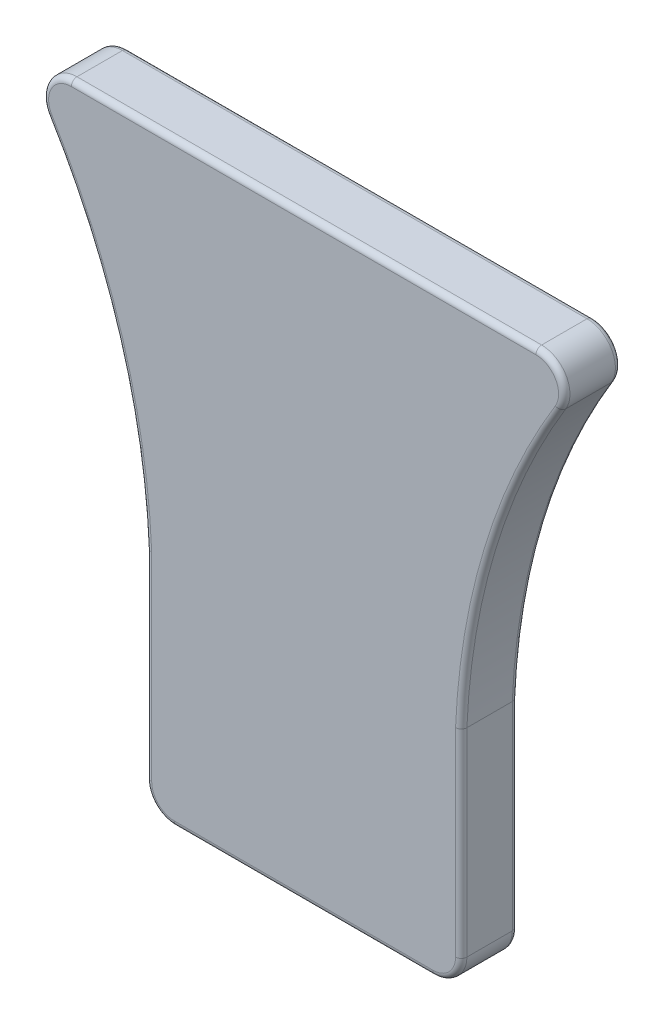
ISO-10303-21;
HEADER;
FILE_DESCRIPTION(('STEP AP214'),'2;1');
FILE_NAME('part.step','',(''),(''),'','','');
FILE_SCHEMA(('AUTOMOTIVE_DESIGN { 1 0 10303 214 1 1 1 1 }'));
ENDSEC;
DATA;
#1=APPLICATION_CONTEXT('core data for automotive mechanical design processes');
#2=APPLICATION_PROTOCOL_DEFINITION('international standard','automotive_design',2000,#1);
#3=PRODUCT_CONTEXT('',#1,'mechanical');
#4=PRODUCT('Part','Part','',(#3));
#5=PRODUCT_RELATED_PRODUCT_CATEGORY('part','',(#4));
#6=PRODUCT_DEFINITION_FORMATION('','',#4);
#7=PRODUCT_DEFINITION_CONTEXT('part definition',#1,'design');
#8=PRODUCT_DEFINITION('design','',#6,#7);
#9=PRODUCT_DEFINITION_SHAPE('','',#8);
#10=(LENGTH_UNIT() NAMED_UNIT(*) SI_UNIT(.MILLI.,.METRE.));
#11=(NAMED_UNIT(*) PLANE_ANGLE_UNIT() SI_UNIT($,.RADIAN.));
#12=(NAMED_UNIT(*) SI_UNIT($,.STERADIAN.) SOLID_ANGLE_UNIT());
#13=UNCERTAINTY_MEASURE_WITH_UNIT(LENGTH_MEASURE(1.E-05),#10,'distance_accuracy_value','');
#14=(GEOMETRIC_REPRESENTATION_CONTEXT(3) GLOBAL_UNCERTAINTY_ASSIGNED_CONTEXT((#13)) GLOBAL_UNIT_ASSIGNED_CONTEXT((#10,
#11,#12)) REPRESENTATION_CONTEXT('',''));
#15=CARTESIAN_POINT('',(0.,0.,0.));
#16=DIRECTION('',(0.,0.,1.));
#17=DIRECTION('',(1.,0.,0.));
#18=AXIS2_PLACEMENT_3D('',#15,#16,#17);
#19=CARTESIAN_POINT('',(-22.7713174122212,5.,10.));
#20=DIRECTION('',(0.,0.,-1.));
#21=DIRECTION('',(-1.,0.,0.));
#22=AXIS2_PLACEMENT_3D('',#19,#20,#21);
#23=CYLINDRICAL_SURFACE('',#22,5.);
#24=DIRECTION('',(0.,0.,-1.));
#25=VECTOR('',#24,1.);
#26=CARTESIAN_POINT('',(-27.7713174122212,5.00000000000004,10.));
#27=LINE('',#26,#25);
#28=CARTESIAN_POINT('',(-27.7713174122212,5.00000000000004,9.));
#29=VERTEX_POINT('',#28);
#30=CARTESIAN_POINT('',(-27.7713174122212,5.00000000000004,0.999999999999999));
#31=VERTEX_POINT('',#30);
#32=EDGE_CURVE('E391',#29,#31,#27,.T.);
#33=ORIENTED_EDGE('',*,*,#32,.T.);
#34=CARTESIAN_POINT('',(-22.7713174122212,5.,0.999999999999999));
#35=DIRECTION('',(0.,0.,1.));
#36=DIRECTION('',(1.,0.,0.));
#37=AXIS2_PLACEMENT_3D('',#34,#35,#36);
#38=CIRCLE('',#37,5.);
#39=CARTESIAN_POINT('',(-22.7713174122212,0.,0.999999999999999));
#40=VERTEX_POINT('',#39);
#41=EDGE_CURVE('E248',#31,#40,#38,.T.);
#42=ORIENTED_EDGE('',*,*,#41,.T.);
#43=DIRECTION('',(0.,0.,-1.));
#44=VECTOR('',#43,1.);
#45=CARTESIAN_POINT('',(-22.7713174122212,0.,10.));
#46=LINE('',#45,#44);
#47=CARTESIAN_POINT('',(-22.7713174122212,0.,9.));
#48=VERTEX_POINT('',#47);
#49=EDGE_CURVE('E206',#48,#40,#46,.T.);
#50=ORIENTED_EDGE('',*,*,#49,.F.);
#51=CARTESIAN_POINT('',(-22.7713174122212,5.,9.));
#52=DIRECTION('',(0.,0.,1.));
#53=DIRECTION('',(1.,0.,0.));
#54=AXIS2_PLACEMENT_3D('',#51,#52,#53);
#55=CIRCLE('',#54,5.);
#56=EDGE_CURVE('E246',#48,#29,#55,.F.);
#57=ORIENTED_EDGE('',*,*,#56,.T.);
#58=EDGE_LOOP('',(#33,#42,#50,#57));
#59=FACE_BOUND('',#58,.T.);
#60=ADVANCED_FACE('F33',(#59),#23,.T.);
#61=CARTESIAN_POINT('',(-22.7713174122212,0.,10.));
#62=DIRECTION('',(0.,1.,0.));
#63=DIRECTION('',(0.,0.,1.));
#64=AXIS2_PLACEMENT_3D('',#61,#62,#63);
#65=PLANE('',#64);
#66=ORIENTED_EDGE('',*,*,#49,.T.);
#67=DIRECTION('',(1.,0.,0.));
#68=VECTOR('',#67,1.);
#69=CARTESIAN_POINT('',(-22.7713174122212,0.,0.999999999999999));
#70=LINE('',#69,#68);
#71=CARTESIAN_POINT('',(22.7713174122212,0.,0.999999999999999));
#72=VERTEX_POINT('',#71);
#73=EDGE_CURVE('E271',#40,#72,#70,.T.);
#74=ORIENTED_EDGE('',*,*,#73,.T.);
#75=DIRECTION('',(0.,0.,-1.));
#76=VECTOR('',#75,1.);
#77=CARTESIAN_POINT('',(22.7713174122212,0.,10.));
#78=LINE('',#77,#76);
#79=CARTESIAN_POINT('',(22.7713174122212,0.,9.));
#80=VERTEX_POINT('',#79);
#81=EDGE_CURVE('E433',#80,#72,#78,.T.);
#82=ORIENTED_EDGE('',*,*,#81,.F.);
#83=DIRECTION('',(1.,0.,0.));
#84=VECTOR('',#83,1.);
#85=CARTESIAN_POINT('',(-22.7713174122212,0.,9.));
#86=LINE('',#85,#84);
#87=EDGE_CURVE('E269',#80,#48,#86,.F.);
#88=ORIENTED_EDGE('',*,*,#87,.T.);
#89=EDGE_LOOP('',(#66,#74,#82,#88));
#90=FACE_BOUND('',#89,.T.);
#91=ADVANCED_FACE('F352',(#90),#65,.F.);
#92=CARTESIAN_POINT('',(22.7713174122212,5.,10.));
#93=DIRECTION('',(0.,0.,-1.));
#94=DIRECTION('',(-1.,0.,0.));
#95=AXIS2_PLACEMENT_3D('',#92,#93,#94);
#96=CYLINDRICAL_SURFACE('',#95,5.00000000000001);
#97=ORIENTED_EDGE('',*,*,#81,.T.);
#98=CARTESIAN_POINT('',(22.7713174122212,5.,0.999999999999999));
#99=DIRECTION('',(0.,0.,1.));
#100=DIRECTION('',(1.,0.,0.));
#101=AXIS2_PLACEMENT_3D('',#98,#99,#100);
#102=CIRCLE('',#101,5.00000000000001);
#103=CARTESIAN_POINT('',(27.7713174122212,5.00000000000004,0.999999999999999));
#104=VERTEX_POINT('',#103);
#105=EDGE_CURVE('E256',#72,#104,#102,.T.);
#106=ORIENTED_EDGE('',*,*,#105,.T.);
#107=DIRECTION('',(0.,0.,-1.));
#108=VECTOR('',#107,1.);
#109=CARTESIAN_POINT('',(27.7713174122212,5.00000000000004,10.));
#110=LINE('',#109,#108);
#111=CARTESIAN_POINT('',(27.7713174122212,5.00000000000004,9.));
#112=VERTEX_POINT('',#111);
#113=EDGE_CURVE('E436',#112,#104,#110,.T.);
#114=ORIENTED_EDGE('',*,*,#113,.F.);
#115=CARTESIAN_POINT('',(22.7713174122212,5.,9.));
#116=DIRECTION('',(0.,0.,1.));
#117=DIRECTION('',(1.,0.,0.));
#118=AXIS2_PLACEMENT_3D('',#115,#116,#117);
#119=CIRCLE('',#118,5.00000000000001);
#120=EDGE_CURVE('E254',#112,#80,#119,.F.);
#121=ORIENTED_EDGE('',*,*,#120,.T.);
#122=EDGE_LOOP('',(#97,#106,#114,#121));
#123=FACE_BOUND('',#122,.T.);
#124=ADVANCED_FACE('F358',(#123),#96,.T.);
#125=CARTESIAN_POINT('',(27.7713174122212,5.00000000000004,10.));
#126=DIRECTION('',(-1.,0.,0.));
#127=DIRECTION('',(0.,-1.,0.));
#128=AXIS2_PLACEMENT_3D('',#125,#126,#127);
#129=PLANE('',#128);
#130=ORIENTED_EDGE('',*,*,#113,.T.);
#131=DIRECTION('',(0.,1.,0.));
#132=VECTOR('',#131,1.);
#133=CARTESIAN_POINT('',(27.7713174122212,5.00000000000004,0.999999999999999));
#134=LINE('',#133,#132);
#135=CARTESIAN_POINT('',(27.7713174122212,40.,0.999999999999999));
#136=VERTEX_POINT('',#135);
#137=EDGE_CURVE('E252',#104,#136,#134,.T.);
#138=ORIENTED_EDGE('',*,*,#137,.T.);
#139=DIRECTION('',(0.,0.,-1.));
#140=VECTOR('',#139,1.);
#141=CARTESIAN_POINT('',(27.7713174122212,40.,10.));
#142=LINE('',#141,#140);
#143=CARTESIAN_POINT('',(27.7713174122212,40.,9.));
#144=VERTEX_POINT('',#143);
#145=EDGE_CURVE('E199',#144,#136,#142,.T.);
#146=ORIENTED_EDGE('',*,*,#145,.F.);
#147=DIRECTION('',(0.,1.,0.));
#148=VECTOR('',#147,1.);
#149=CARTESIAN_POINT('',(27.7713174122212,5.00000000000004,9.));
#150=LINE('',#149,#148);
#151=EDGE_CURVE('E250',#144,#112,#150,.F.);
#152=ORIENTED_EDGE('',*,*,#151,.T.);
#153=EDGE_LOOP('',(#130,#138,#146,#152));
#154=FACE_BOUND('',#153,.T.);
#155=ADVANCED_FACE('F524',(#154),#129,.F.);
#156=CARTESIAN_POINT('',(147.663922100317,34.9242398496352,10.));
#157=DIRECTION('',(0.,0.,-1.));
#158=DIRECTION('',(-1.,0.,0.));
#159=AXIS2_PLACEMENT_3D('',#156,#157,#158);
#160=CYLINDRICAL_SURFACE('',#159,120.);
#161=ORIENTED_EDGE('',*,*,#145,.T.);
#162=CARTESIAN_POINT('',(147.663922100317,34.9242398496352,0.999999999999999));
#163=DIRECTION('',(0.,0.,1.));
#164=DIRECTION('',(1.,0.,0.));
#165=AXIS2_PLACEMENT_3D('',#162,#163,#164);
#166=CIRCLE('',#165,120.);
#167=CARTESIAN_POINT('',(45.2082827323963,97.3969695939854,0.999999999999999));
#168=VERTEX_POINT('',#167);
#169=EDGE_CURVE('E198',#136,#168,#166,.F.);
#170=ORIENTED_EDGE('',*,*,#169,.T.);
#171=DIRECTION('',(0.,0.,-1.));
#172=VECTOR('',#171,1.);
#173=CARTESIAN_POINT('',(45.2082827323963,97.3969695939854,10.));
#174=LINE('',#173,#172);
#175=CARTESIAN_POINT('',(45.2082827323963,97.3969695939854,9.));
#176=VERTEX_POINT('',#175);
#177=EDGE_CURVE('E179',#176,#168,#174,.T.);
#178=ORIENTED_EDGE('',*,*,#177,.F.);
#179=CARTESIAN_POINT('',(147.663922100317,34.9242398496352,9.));
#180=DIRECTION('',(0.,0.,1.));
#181=DIRECTION('',(1.,0.,0.));
#182=AXIS2_PLACEMENT_3D('',#179,#180,#181);
#183=CIRCLE('',#182,120.);
#184=EDGE_CURVE('E195',#176,#144,#183,.T.);
#185=ORIENTED_EDGE('',*,*,#184,.T.);
#186=EDGE_LOOP('',(#161,#170,#178,#185));
#187=FACE_BOUND('',#186,.T.);
#188=ADVANCED_FACE('F194',(#187),#160,.F.);
#189=CARTESIAN_POINT('',(40.9392977587329,100.,10.));
#190=DIRECTION('',(0.,0.,-1.));
#191=DIRECTION('',(-1.,0.,0.));
#192=AXIS2_PLACEMENT_3D('',#189,#190,#191);
#193=CYLINDRICAL_SURFACE('',#192,5.00000000000002);
#194=ORIENTED_EDGE('',*,*,#177,.T.);
#195=CARTESIAN_POINT('',(40.9392977587329,100.,0.999999999999999));
#196=DIRECTION('',(0.,0.,1.));
#197=DIRECTION('',(1.,0.,0.));
#198=AXIS2_PLACEMENT_3D('',#195,#196,#197);
#199=CIRCLE('',#198,5.00000000000002);
#200=CARTESIAN_POINT('',(40.9392977587329,105.,0.999999999999999));
#201=VERTEX_POINT('',#200);
#202=EDGE_CURVE('E186',#168,#201,#199,.T.);
#203=ORIENTED_EDGE('',*,*,#202,.T.);
#204=DIRECTION('',(0.,0.,-1.));
#205=VECTOR('',#204,1.);
#206=CARTESIAN_POINT('',(40.9392977587329,105.,10.));
#207=LINE('',#206,#205);
#208=CARTESIAN_POINT('',(40.9392977587329,105.,9.));
#209=VERTEX_POINT('',#208);
#210=EDGE_CURVE('E181',#209,#201,#207,.T.);
#211=ORIENTED_EDGE('',*,*,#210,.F.);
#212=CARTESIAN_POINT('',(40.9392977587329,100.,9.));
#213=DIRECTION('',(0.,0.,1.));
#214=DIRECTION('',(1.,0.,0.));
#215=AXIS2_PLACEMENT_3D('',#212,#213,#214);
#216=CIRCLE('',#215,5.00000000000002);
#217=EDGE_CURVE('E176',#209,#176,#216,.F.);
#218=ORIENTED_EDGE('',*,*,#217,.T.);
#219=EDGE_LOOP('',(#194,#203,#211,#218));
#220=FACE_BOUND('',#219,.T.);
#221=ADVANCED_FACE('F178',(#220),#193,.T.);
#222=CARTESIAN_POINT('',(-40.9392977587329,105.,10.));
#223=DIRECTION('',(0.,-1.,0.));
#224=DIRECTION('',(0.,0.,-1.));
#225=AXIS2_PLACEMENT_3D('',#222,#223,#224);
#226=PLANE('',#225);
#227=ORIENTED_EDGE('',*,*,#210,.T.);
#228=DIRECTION('',(-1.,0.,0.));
#229=VECTOR('',#228,1.);
#230=CARTESIAN_POINT('',(-40.9392977587329,105.,0.999999999999999));
#231=LINE('',#230,#229);
#232=CARTESIAN_POINT('',(-40.9392977587329,105.,0.999999999999999));
#233=VERTEX_POINT('',#232);
#234=EDGE_CURVE('E232',#201,#233,#231,.T.);
#235=ORIENTED_EDGE('',*,*,#234,.T.);
#236=DIRECTION('',(0.,0.,-1.));
#237=VECTOR('',#236,1.);
#238=CARTESIAN_POINT('',(-40.9392977587329,105.,10.));
#239=LINE('',#238,#237);
#240=CARTESIAN_POINT('',(-40.9392977587329,105.,9.));
#241=VERTEX_POINT('',#240);
#242=EDGE_CURVE('E441',#241,#233,#239,.T.);
#243=ORIENTED_EDGE('',*,*,#242,.F.);
#244=DIRECTION('',(-1.,0.,0.));
#245=VECTOR('',#244,1.);
#246=CARTESIAN_POINT('',(40.9392977587329,105.,9.));
#247=LINE('',#246,#245);
#248=EDGE_CURVE('E403',#241,#209,#247,.F.);
#249=ORIENTED_EDGE('',*,*,#248,.T.);
#250=EDGE_LOOP('',(#227,#235,#243,#249));
#251=FACE_BOUND('',#250,.T.);
#252=ADVANCED_FACE('F506',(#251),#226,.F.);
#253=CARTESIAN_POINT('',(-40.9392977587329,100.,10.));
#254=DIRECTION('',(0.,0.,-1.));
#255=DIRECTION('',(-1.,0.,0.));
#256=AXIS2_PLACEMENT_3D('',#253,#254,#255);
#257=CYLINDRICAL_SURFACE('',#256,5.00000000000002);
#258=ORIENTED_EDGE('',*,*,#242,.T.);
#259=CARTESIAN_POINT('',(-40.9392977587329,100.,0.999999999999999));
#260=DIRECTION('',(0.,0.,1.));
#261=DIRECTION('',(1.,0.,0.));
#262=AXIS2_PLACEMENT_3D('',#259,#260,#261);
#263=CIRCLE('',#262,5.00000000000002);
#264=CARTESIAN_POINT('',(-45.2082827323963,97.3969695939854,0.999999999999999));
#265=VERTEX_POINT('',#264);
#266=EDGE_CURVE('E387',#233,#265,#263,.T.);
#267=ORIENTED_EDGE('',*,*,#266,.T.);
#268=DIRECTION('',(0.,0.,-1.));
#269=VECTOR('',#268,1.);
#270=CARTESIAN_POINT('',(-45.2082827323963,97.3969695939854,10.));
#271=LINE('',#270,#269);
#272=CARTESIAN_POINT('',(-45.2082827323963,97.3969695939854,9.));
#273=VERTEX_POINT('',#272);
#274=EDGE_CURVE('E444',#273,#265,#271,.T.);
#275=ORIENTED_EDGE('',*,*,#274,.F.);
#276=CARTESIAN_POINT('',(-40.9392977587329,100.,9.));
#277=DIRECTION('',(0.,0.,1.));
#278=DIRECTION('',(1.,0.,0.));
#279=AXIS2_PLACEMENT_3D('',#276,#277,#278);
#280=CIRCLE('',#279,5.00000000000002);
#281=EDGE_CURVE('E414',#273,#241,#280,.F.);
#282=ORIENTED_EDGE('',*,*,#281,.T.);
#283=EDGE_LOOP('',(#258,#267,#275,#282));
#284=FACE_BOUND('',#283,.T.);
#285=ADVANCED_FACE('F502',(#284),#257,.T.);
#286=CARTESIAN_POINT('',(-147.663922100317,34.9242398496352,10.));
#287=DIRECTION('',(0.,0.,-1.));
#288=DIRECTION('',(-1.,0.,0.));
#289=AXIS2_PLACEMENT_3D('',#286,#287,#288);
#290=CYLINDRICAL_SURFACE('',#289,120.);
#291=ORIENTED_EDGE('',*,*,#274,.T.);
#292=CARTESIAN_POINT('',(-147.663922100317,34.9242398496352,0.999999999999999));
#293=DIRECTION('',(0.,0.,1.));
#294=DIRECTION('',(1.,0.,0.));
#295=AXIS2_PLACEMENT_3D('',#292,#293,#294);
#296=CIRCLE('',#295,120.);
#297=CARTESIAN_POINT('',(-27.7713174122212,40.,0.999999999999999));
#298=VERTEX_POINT('',#297);
#299=EDGE_CURVE('E416',#265,#298,#296,.F.);
#300=ORIENTED_EDGE('',*,*,#299,.T.);
#301=DIRECTION('',(0.,0.,-1.));
#302=VECTOR('',#301,1.);
#303=CARTESIAN_POINT('',(-27.7713174122212,40.,10.));
#304=LINE('',#303,#302);
#305=CARTESIAN_POINT('',(-27.7713174122212,40.,9.));
#306=VERTEX_POINT('',#305);
#307=EDGE_CURVE('E393',#306,#298,#304,.T.);
#308=ORIENTED_EDGE('',*,*,#307,.F.);
#309=CARTESIAN_POINT('',(-147.663922100317,34.9242398496352,9.));
#310=DIRECTION('',(0.,0.,1.));
#311=DIRECTION('',(1.,0.,0.));
#312=AXIS2_PLACEMENT_3D('',#309,#310,#311);
#313=CIRCLE('',#312,120.);
#314=EDGE_CURVE('E419',#306,#273,#313,.T.);
#315=ORIENTED_EDGE('',*,*,#314,.T.);
#316=EDGE_LOOP('',(#291,#300,#308,#315));
#317=FACE_BOUND('',#316,.T.);
#318=ADVANCED_FACE('F500',(#317),#290,.F.);
#319=CARTESIAN_POINT('',(-27.7713174122212,5.00000000000004,10.));
#320=DIRECTION('',(1.,0.,0.));
#321=DIRECTION('',(0.,0.,-1.));
#322=AXIS2_PLACEMENT_3D('',#319,#320,#321);
#323=PLANE('',#322);
#324=ORIENTED_EDGE('',*,*,#307,.T.);
#325=DIRECTION('',(0.,-1.,0.));
#326=VECTOR('',#325,1.);
#327=CARTESIAN_POINT('',(-27.7713174122212,5.00000000000004,0.999999999999999));
#328=LINE('',#327,#326);
#329=EDGE_CURVE('E231',#298,#31,#328,.T.);
#330=ORIENTED_EDGE('',*,*,#329,.T.);
#331=ORIENTED_EDGE('',*,*,#32,.F.);
#332=DIRECTION('',(0.,-1.,0.));
#333=VECTOR('',#332,1.);
#334=CARTESIAN_POINT('',(-27.7713174122212,51.2571312379973,9.));
#335=LINE('',#334,#333);
#336=EDGE_CURVE('E229',#29,#306,#335,.F.);
#337=ORIENTED_EDGE('',*,*,#336,.T.);
#338=EDGE_LOOP('',(#324,#330,#331,#337));
#339=FACE_BOUND('',#338,.T.);
#340=ADVANCED_FACE('F451',(#339),#323,.F.);
#341=CARTESIAN_POINT('',(-22.7713174122212,5.,10.));
#342=DIRECTION('',(0.,0.,1.));
#343=DIRECTION('',(1.,0.,0.));
#344=AXIS2_PLACEMENT_3D('',#341,#342,#343);
#345=PLANE('',#344);
#346=CARTESIAN_POINT('',(-147.663922100317,34.9242398496352,10.));
#347=DIRECTION('',(0.,0.,1.));
#348=DIRECTION('',(1.,0.,0.));
#349=AXIS2_PLACEMENT_3D('',#346,#347,#348);
#350=CIRCLE('',#349,121.);
#351=CARTESIAN_POINT('',(-44.3544857376636,97.9175756751883,10.));
#352=VERTEX_POINT('',#351);
#353=CARTESIAN_POINT('',(-26.7713174122212,40.0211145516305,10.));
#354=VERTEX_POINT('',#353);
#355=EDGE_CURVE('E51',#352,#354,#350,.F.);
#356=ORIENTED_EDGE('',*,*,#355,.T.);
#357=DIRECTION('',(0.,-1.,0.));
#358=VECTOR('',#357,1.);
#359=CARTESIAN_POINT('',(-26.7713174122212,5.00000000000004,10.));
#360=LINE('',#359,#358);
#361=CARTESIAN_POINT('',(-26.7713174122212,5.00000000000004,10.));
#362=VERTEX_POINT('',#361);
#363=EDGE_CURVE('E267',#354,#362,#360,.T.);
#364=ORIENTED_EDGE('',*,*,#363,.T.);
#365=CARTESIAN_POINT('',(-22.7713174122212,5.,10.));
#366=DIRECTION('',(0.,0.,1.));
#367=DIRECTION('',(1.,0.,0.));
#368=AXIS2_PLACEMENT_3D('',#365,#366,#367);
#369=CIRCLE('',#368,4.);
#370=CARTESIAN_POINT('',(-22.7713174122212,1.,10.));
#371=VERTEX_POINT('',#370);
#372=EDGE_CURVE('E265',#362,#371,#369,.T.);
#373=ORIENTED_EDGE('',*,*,#372,.T.);
#374=DIRECTION('',(1.,0.,0.));
#375=VECTOR('',#374,1.);
#376=CARTESIAN_POINT('',(22.7713174122212,1.,10.));
#377=LINE('',#376,#375);
#378=CARTESIAN_POINT('',(22.7713174122212,1.,10.));
#379=VERTEX_POINT('',#378);
#380=EDGE_CURVE('E258',#371,#379,#377,.T.);
#381=ORIENTED_EDGE('',*,*,#380,.T.);
#382=CARTESIAN_POINT('',(22.7713174122212,5.,10.));
#383=DIRECTION('',(0.,0.,1.));
#384=DIRECTION('',(1.,0.,0.));
#385=AXIS2_PLACEMENT_3D('',#382,#383,#384);
#386=CIRCLE('',#385,4.00000000000001);
#387=CARTESIAN_POINT('',(26.7713174122212,5.00000000000004,10.));
#388=VERTEX_POINT('',#387);
#389=EDGE_CURVE('E260',#379,#388,#386,.T.);
#390=ORIENTED_EDGE('',*,*,#389,.T.);
#391=DIRECTION('',(0.,1.,0.));
#392=VECTOR('',#391,1.);
#393=CARTESIAN_POINT('',(26.7713174122212,51.2571312379972,10.));
#394=LINE('',#393,#392);
#395=CARTESIAN_POINT('',(26.7713174122212,40.0211145516305,10.));
#396=VERTEX_POINT('',#395);
#397=EDGE_CURVE('E262',#388,#396,#394,.T.);
#398=ORIENTED_EDGE('',*,*,#397,.T.);
#399=CARTESIAN_POINT('',(147.663922100317,34.9242398496352,10.));
#400=DIRECTION('',(0.,0.,1.));
#401=DIRECTION('',(1.,0.,0.));
#402=AXIS2_PLACEMENT_3D('',#399,#400,#401);
#403=CIRCLE('',#402,121.);
#404=CARTESIAN_POINT('',(44.3544857376636,97.9175756751883,10.));
#405=VERTEX_POINT('',#404);
#406=EDGE_CURVE('E405',#396,#405,#403,.F.);
#407=ORIENTED_EDGE('',*,*,#406,.T.);
#408=CARTESIAN_POINT('',(40.9392977587329,100.,10.));
#409=DIRECTION('',(0.,0.,1.));
#410=DIRECTION('',(1.,0.,0.));
#411=AXIS2_PLACEMENT_3D('',#408,#409,#410);
#412=CIRCLE('',#411,4.00000000000002);
#413=CARTESIAN_POINT('',(40.9392977587329,104.,10.));
#414=VERTEX_POINT('',#413);
#415=EDGE_CURVE('E209',#405,#414,#412,.T.);
#416=ORIENTED_EDGE('',*,*,#415,.T.);
#417=DIRECTION('',(-1.,0.,0.));
#418=VECTOR('',#417,1.);
#419=CARTESIAN_POINT('',(-40.9392977587329,104.,10.));
#420=LINE('',#419,#418);
#421=CARTESIAN_POINT('',(-40.9392977587329,104.,10.));
#422=VERTEX_POINT('',#421);
#423=EDGE_CURVE('E411',#414,#422,#420,.T.);
#424=ORIENTED_EDGE('',*,*,#423,.T.);
#425=CARTESIAN_POINT('',(-40.9392977587329,100.,10.));
#426=DIRECTION('',(0.,0.,1.));
#427=DIRECTION('',(1.,0.,0.));
#428=AXIS2_PLACEMENT_3D('',#425,#426,#427);
#429=CIRCLE('',#428,4.00000000000002);
#430=EDGE_CURVE('E409',#422,#352,#429,.T.);
#431=ORIENTED_EDGE('',*,*,#430,.T.);
#432=EDGE_LOOP('',(#356,#364,#373,#381,#390,#398,#407,#416,#424,#431));
#433=FACE_BOUND('',#432,.T.);
#434=ADVANCED_FACE('F492',(#433),#345,.T.);
#435=CARTESIAN_POINT('',(-22.7713174122212,5.,0.));
#436=DIRECTION('',(0.,0.,1.));
#437=DIRECTION('',(1.,0.,0.));
#438=AXIS2_PLACEMENT_3D('',#435,#436,#437);
#439=PLANE('',#438);
#440=DIRECTION('',(0.,-1.,0.));
#441=VECTOR('',#440,1.);
#442=CARTESIAN_POINT('',(-26.7713174122212,5.,0.));
#443=LINE('',#442,#441);
#444=CARTESIAN_POINT('',(-26.7713174122212,5.00000000000004,0.));
#445=VERTEX_POINT('',#444);
#446=CARTESIAN_POINT('',(-26.7713174122212,40.0211145516305,0.));
#447=VERTEX_POINT('',#446);
#448=EDGE_CURVE('E243',#445,#447,#443,.F.);
#449=ORIENTED_EDGE('',*,*,#448,.T.);
#450=CARTESIAN_POINT('',(-147.663922100317,34.9242398496352,0.));
#451=DIRECTION('',(0.,0.,1.));
#452=DIRECTION('',(1.,0.,0.));
#453=AXIS2_PLACEMENT_3D('',#450,#451,#452);
#454=CIRCLE('',#453,121.);
#455=CARTESIAN_POINT('',(-44.3544857376636,97.9175756751883,0.));
#456=VERTEX_POINT('',#455);
#457=EDGE_CURVE('E425',#447,#456,#454,.T.);
#458=ORIENTED_EDGE('',*,*,#457,.T.);
#459=CARTESIAN_POINT('',(-40.9392977587329,100.,0.));
#460=DIRECTION('',(0.,0.,1.));
#461=DIRECTION('',(1.,0.,0.));
#462=AXIS2_PLACEMENT_3D('',#459,#460,#461);
#463=CIRCLE('',#462,4.00000000000002);
#464=CARTESIAN_POINT('',(-40.9392977587329,104.,0.));
#465=VERTEX_POINT('',#464);
#466=EDGE_CURVE('E389',#456,#465,#463,.F.);
#467=ORIENTED_EDGE('',*,*,#466,.T.);
#468=DIRECTION('',(-1.,0.,0.));
#469=VECTOR('',#468,1.);
#470=CARTESIAN_POINT('',(-22.7713174122212,104.,0.));
#471=LINE('',#470,#469);
#472=CARTESIAN_POINT('',(40.9392977587329,104.,0.));
#473=VERTEX_POINT('',#472);
#474=EDGE_CURVE('E428',#465,#473,#471,.F.);
#475=ORIENTED_EDGE('',*,*,#474,.T.);
#476=CARTESIAN_POINT('',(40.9392977587329,100.,0.));
#477=DIRECTION('',(0.,0.,1.));
#478=DIRECTION('',(1.,0.,0.));
#479=AXIS2_PLACEMENT_3D('',#476,#477,#478);
#480=CIRCLE('',#479,4.00000000000002);
#481=CARTESIAN_POINT('',(44.3544857376636,97.9175756751883,0.));
#482=VERTEX_POINT('',#481);
#483=EDGE_CURVE('E423',#473,#482,#480,.F.);
#484=ORIENTED_EDGE('',*,*,#483,.T.);
#485=CARTESIAN_POINT('',(147.663922100317,34.9242398496352,0.));
#486=DIRECTION('',(0.,0.,1.));
#487=DIRECTION('',(1.,0.,0.));
#488=AXIS2_PLACEMENT_3D('',#485,#486,#487);
#489=CIRCLE('',#488,121.);
#490=CARTESIAN_POINT('',(26.7713174122212,40.0211145516305,0.));
#491=VERTEX_POINT('',#490);
#492=EDGE_CURVE('E187',#482,#491,#489,.T.);
#493=ORIENTED_EDGE('',*,*,#492,.T.);
#494=DIRECTION('',(0.,1.,0.));
#495=VECTOR('',#494,1.);
#496=CARTESIAN_POINT('',(26.7713174122212,5.00000000000002,0.));
#497=LINE('',#496,#495);
#498=CARTESIAN_POINT('',(26.7713174122212,5.00000000000004,0.));
#499=VERTEX_POINT('',#498);
#500=EDGE_CURVE('E239',#491,#499,#497,.F.);
#501=ORIENTED_EDGE('',*,*,#500,.T.);
#502=CARTESIAN_POINT('',(22.7713174122212,5.,0.));
#503=DIRECTION('',(0.,0.,1.));
#504=DIRECTION('',(1.,0.,0.));
#505=AXIS2_PLACEMENT_3D('',#502,#503,#504);
#506=CIRCLE('',#505,4.00000000000001);
#507=CARTESIAN_POINT('',(22.7713174122212,1.,0.));
#508=VERTEX_POINT('',#507);
#509=EDGE_CURVE('E237',#499,#508,#506,.F.);
#510=ORIENTED_EDGE('',*,*,#509,.T.);
#511=DIRECTION('',(1.,0.,0.));
#512=VECTOR('',#511,1.);
#513=CARTESIAN_POINT('',(-22.7713174122212,1.,0.));
#514=LINE('',#513,#512);
#515=CARTESIAN_POINT('',(-22.7713174122212,1.,0.));
#516=VERTEX_POINT('',#515);
#517=EDGE_CURVE('E235',#508,#516,#514,.F.);
#518=ORIENTED_EDGE('',*,*,#517,.T.);
#519=CARTESIAN_POINT('',(-22.7713174122212,5.,0.));
#520=DIRECTION('',(0.,0.,1.));
#521=DIRECTION('',(1.,0.,0.));
#522=AXIS2_PLACEMENT_3D('',#519,#520,#521);
#523=CIRCLE('',#522,4.);
#524=EDGE_CURVE('E241',#516,#445,#523,.F.);
#525=ORIENTED_EDGE('',*,*,#524,.T.);
#526=EDGE_LOOP('',(#449,#458,#467,#475,#484,#493,#501,#510,#518,#525));
#527=FACE_BOUND('',#526,.T.);
#528=ADVANCED_FACE('F380',(#527),#439,.F.);
#529=CARTESIAN_POINT('',(-147.663922100317,34.9242398496352,0.999999999999999));
#530=DIRECTION('',(0.,0.,1.));
#531=DIRECTION('',(1.,0.,0.));
#532=AXIS2_PLACEMENT_3D('',#529,#530,#531);
#533=TOROIDAL_SURFACE('',#532,121.,1.);
#534=ORIENTED_EDGE('',*,*,#457,.F.);
#535=CARTESIAN_POINT('',(-27.7713174122212,40.,0.999999999999999));
#536=CARTESIAN_POINT('',(-27.7713172276629,40.0000000032997,0.97187083422066));
#537=CARTESIAN_POINT('',(-27.7701297921027,40.0000251282893,0.943755146931359));
#538=CARTESIAN_POINT('',(-27.765392648994,40.0001253577356,0.887724980926686));
#539=CARTESIAN_POINT('',(-27.7618430554946,40.0002004597794,0.859810492562827));
#540=CARTESIAN_POINT('',(-27.7476841729658,40.0005000227128,0.77671391803359));
#541=CARTESIAN_POINT('',(-27.733564692432,40.000798742328,0.722088538814645));
#542=CARTESIAN_POINT('',(-27.696357759375,40.0015857988132,0.615985924186101));
#543=CARTESIAN_POINT('',(-27.6732660272821,40.0020742261698,0.564510204678195));
#544=CARTESIAN_POINT('',(-27.61877504086,40.0032265700096,0.466171583561037));
#545=CARTESIAN_POINT('',(-27.5873778227422,40.0038904434797,0.41930755518662));
#546=CARTESIAN_POINT('',(-27.5171651092573,40.0053746820186,0.331515490330779));
#547=CARTESIAN_POINT('',(-27.4783493697685,40.0061950522371,0.290587649269744));
#548=CARTESIAN_POINT('',(-27.3943834618117,40.007969166533,0.215812909384667));
#549=CARTESIAN_POINT('',(-27.34923089004,40.0089229612123,0.181968709287998));
#550=CARTESIAN_POINT('',(-27.2538669997887,40.010936775432,0.122325511358352));
#551=CARTESIAN_POINT('',(-27.2036528465169,40.0119968544962,0.0965310553638382));
#552=CARTESIAN_POINT('',(-27.0996355805409,40.0141920363241,0.0537646141403305));
#553=CARTESIAN_POINT('',(-27.0458364050946,40.0153270567711,0.0367831245367435));
#554=CARTESIAN_POINT('',(-26.9600068176099,40.0171372023284,0.0174458926686593));
#555=CARTESIAN_POINT('',(-26.9286495423366,40.0177983999772,0.0119410880178533));
#556=CARTESIAN_POINT('',(-26.865581257514,40.019127991422,0.00394715289998957));
#557=CARTESIAN_POINT('',(-26.8338707761508,40.0197963744314,0.00145400587239333));
#558=CARTESIAN_POINT('',(-26.79185831694,40.0206817242712,0.000157944899461151));
#559=CARTESIAN_POINT('',(-26.7815868864164,40.0208981655243,-4.32515174471014E-07));
#560=CARTESIAN_POINT('',(-26.7713174122212,40.0211145516305,0.));
#561=B_SPLINE_CURVE_WITH_KNOTS('',3,(#535,#536,#537,#538,#539,#540,#541,#542,#543,#544,#545,
#546,#547,#548,#549,#550,#551,#552,#553,#554,#555,#556,#557,#558,#559,#560),.UNSPECIFIED.,.F.,
.F.,(4,2,2,2,2,2,2,2,2,2,2,2,4),(0.,0.0843356588927668,0.168667246199269,0.337063313832252,
0.505539801537247,0.67397502298349,0.842415788090553,1.01092060946145,1.17952033369335,
1.34793785112428,1.44334750134978,1.53862976550295,1.56944902684494),.UNSPECIFIED.);
#562=EDGE_CURVE('E273',#447,#298,#561,.F.);
#563=ORIENTED_EDGE('',*,*,#562,.T.);
#564=ORIENTED_EDGE('',*,*,#299,.F.);
#565=CARTESIAN_POINT('',(-44.3544857376637,97.9175756751883,1.));
#566=DIRECTION('',(-0.520606081202915,0.853796994732673,0.));
#567=DIRECTION('',(-0.853796994732673,-0.520606081202915,0.));
#568=AXIS2_PLACEMENT_3D('',#565,#566,#567);
#569=CIRCLE('',#568,1.);
#570=EDGE_CURVE('E220',#456,#265,#569,.T.);
#571=ORIENTED_EDGE('',*,*,#570,.F.);
#572=EDGE_LOOP('',(#534,#563,#564,#571));
#573=FACE_BOUND('',#572,.T.);
#574=ADVANCED_FACE('F289',(#573),#533,.T.);
#575=CARTESIAN_POINT('',(-40.9392977587329,100.,0.999999999999999));
#576=DIRECTION('',(0.,0.,1.));
#577=DIRECTION('',(1.,0.,0.));
#578=AXIS2_PLACEMENT_3D('',#575,#576,#577);
#579=TOROIDAL_SURFACE('',#578,4.00000000000002,1.);
#580=ORIENTED_EDGE('',*,*,#570,.T.);
#581=ORIENTED_EDGE('',*,*,#266,.F.);
#582=CARTESIAN_POINT('',(-40.9392977587329,104.,1.));
#583=DIRECTION('',(1.,0.,0.));
#584=DIRECTION('',(0.,0.,-1.));
#585=AXIS2_PLACEMENT_3D('',#582,#583,#584);
#586=CIRCLE('',#585,1.);
#587=EDGE_CURVE('E392',#465,#233,#586,.T.);
#588=ORIENTED_EDGE('',*,*,#587,.F.);
#589=ORIENTED_EDGE('',*,*,#466,.F.);
#590=EDGE_LOOP('',(#580,#581,#588,#589));
#591=FACE_BOUND('',#590,.T.);
#592=ADVANCED_FACE('F373',(#591),#579,.T.);
#593=CARTESIAN_POINT('',(-40.9392977587329,104.,0.999999999999999));
#594=DIRECTION('',(-1.,0.,0.));
#595=DIRECTION('',(0.,0.,1.));
#596=AXIS2_PLACEMENT_3D('',#593,#594,#595);
#597=CYLINDRICAL_SURFACE('',#596,1.);
#598=ORIENTED_EDGE('',*,*,#587,.T.);
#599=ORIENTED_EDGE('',*,*,#234,.F.);
#600=CARTESIAN_POINT('',(40.9392977587329,104.,1.));
#601=DIRECTION('',(1.,0.,0.));
#602=DIRECTION('',(0.,0.,-1.));
#603=AXIS2_PLACEMENT_3D('',#600,#601,#602);
#604=CIRCLE('',#603,1.);
#605=EDGE_CURVE('E395',#473,#201,#604,.T.);
#606=ORIENTED_EDGE('',*,*,#605,.F.);
#607=ORIENTED_EDGE('',*,*,#474,.F.);
#608=EDGE_LOOP('',(#598,#599,#606,#607));
#609=FACE_BOUND('',#608,.T.);
#610=ADVANCED_FACE('F370',(#609),#597,.T.);
#611=CARTESIAN_POINT('',(40.9392977587329,100.,0.999999999999999));
#612=DIRECTION('',(0.,0.,1.));
#613=DIRECTION('',(1.,0.,0.));
#614=AXIS2_PLACEMENT_3D('',#611,#612,#613);
#615=TOROIDAL_SURFACE('',#614,4.00000000000002,1.);
#616=ORIENTED_EDGE('',*,*,#605,.T.);
#617=ORIENTED_EDGE('',*,*,#202,.F.);
#618=CARTESIAN_POINT('',(44.3544857376636,97.9175756751883,1.));
#619=DIRECTION('',(-0.520606081202912,-0.853796994732675,0.));
#620=DIRECTION('',(0.853796994732675,-0.520606081202912,0.));
#621=AXIS2_PLACEMENT_3D('',#618,#619,#620);
#622=CIRCLE('',#621,1.);
#623=EDGE_CURVE('E228',#482,#168,#622,.T.);
#624=ORIENTED_EDGE('',*,*,#623,.F.);
#625=ORIENTED_EDGE('',*,*,#483,.F.);
#626=EDGE_LOOP('',(#616,#617,#624,#625));
#627=FACE_BOUND('',#626,.T.);
#628=ADVANCED_FACE('F366',(#627),#615,.T.);
#629=CARTESIAN_POINT('',(147.663922100317,34.9242398496352,0.999999999999999));
#630=DIRECTION('',(0.,0.,1.));
#631=DIRECTION('',(1.,0.,0.));
#632=AXIS2_PLACEMENT_3D('',#629,#630,#631);
#633=TOROIDAL_SURFACE('',#632,121.,1.);
#634=ORIENTED_EDGE('',*,*,#169,.F.);
#635=CARTESIAN_POINT('',(27.7713174122212,40.,0.999999999999999));
#636=CARTESIAN_POINT('',(27.7713172276629,40.0000000032997,0.97187083422066));
#637=CARTESIAN_POINT('',(27.7701297921027,40.0000251282893,0.943755146931359));
#638=CARTESIAN_POINT('',(27.765392648994,40.0001253577356,0.887724980926686));
#639=CARTESIAN_POINT('',(27.7618430554946,40.0002004597794,0.859810492562827));
#640=CARTESIAN_POINT('',(27.7476841729658,40.0005000227128,0.77671391803359));
#641=CARTESIAN_POINT('',(27.733564692432,40.000798742328,0.722088538814645));
#642=CARTESIAN_POINT('',(27.696357759375,40.0015857988132,0.615985924186101));
#643=CARTESIAN_POINT('',(27.6732660272821,40.0020742261698,0.564510204678195));
#644=CARTESIAN_POINT('',(27.61877504086,40.0032265700096,0.466171583561037));
#645=CARTESIAN_POINT('',(27.5873778227422,40.0038904434797,0.41930755518662));
#646=CARTESIAN_POINT('',(27.5171651092573,40.0053746820186,0.331515490330779));
#647=CARTESIAN_POINT('',(27.4783493697685,40.0061950522371,0.290587649269743));
#648=CARTESIAN_POINT('',(27.3943834618117,40.007969166533,0.215812909384667));
#649=CARTESIAN_POINT('',(27.34923089004,40.0089229612124,0.181968709287998));
#650=CARTESIAN_POINT('',(27.2538669997887,40.0109367754319,0.122325511358351));
#651=CARTESIAN_POINT('',(27.2036528465169,40.0119968544959,0.0965310553638354));
#652=CARTESIAN_POINT('',(27.0996355805409,40.0141920363238,0.0537646141403279));
#653=CARTESIAN_POINT('',(27.0458364050946,40.015327056771,0.0367831245367428));
#654=CARTESIAN_POINT('',(26.9600068176099,40.0171372023284,0.0174458926686595));
#655=CARTESIAN_POINT('',(26.9286495423366,40.0177983999773,0.0119410880178534));
#656=CARTESIAN_POINT('',(26.865581257514,40.0191279914221,0.00394715289998965));
#657=CARTESIAN_POINT('',(26.8338707761508,40.0197963744314,0.00145400587239333));
#658=CARTESIAN_POINT('',(26.79185831694,40.0206817242712,0.000157944899461139));
#659=CARTESIAN_POINT('',(26.7815868864164,40.0208981655242,-4.32515174482739E-07));
#660=CARTESIAN_POINT('',(26.7713174122212,40.0211145516305,0.));
#661=B_SPLINE_CURVE_WITH_KNOTS('',3,(#635,#636,#637,#638,#639,#640,#641,#642,#643,#644,#645,
#646,#647,#648,#649,#650,#651,#652,#653,#654,#655,#656,#657,#658,#659,#660),.UNSPECIFIED.,.F.,
.F.,(4,2,2,2,2,2,2,2,2,2,2,2,4),(0.,0.0843356588927668,0.168667246199269,0.337063313832252,
0.505539801537247,0.67397502298349,0.842415788090553,1.01092060946145,1.17952033369335,
1.34793785112428,1.44334750134978,1.53862976550295,1.56944902684494),.UNSPECIFIED.);
#662=EDGE_CURVE('E281',#136,#491,#661,.T.);
#663=ORIENTED_EDGE('',*,*,#662,.T.);
#664=ORIENTED_EDGE('',*,*,#492,.F.);
#665=ORIENTED_EDGE('',*,*,#623,.T.);
#666=EDGE_LOOP('',(#634,#663,#664,#665));
#667=FACE_BOUND('',#666,.T.);
#668=ADVANCED_FACE('F349',(#667),#633,.T.);
#669=CARTESIAN_POINT('',(-147.663922100317,34.9242398496352,9.));
#670=DIRECTION('',(0.,0.,1.));
#671=DIRECTION('',(1.,0.,0.));
#672=AXIS2_PLACEMENT_3D('',#669,#670,#671);
#673=TOROIDAL_SURFACE('',#672,121.,1.);
#674=ORIENTED_EDGE('',*,*,#314,.F.);
#675=CARTESIAN_POINT('',(-27.7713174122212,40.,9.));
#676=CARTESIAN_POINT('',(-27.7713172276629,40.0000000032996,9.02812916577934));
#677=CARTESIAN_POINT('',(-27.7701297921027,40.0000251282892,9.05624485306864));
#678=CARTESIAN_POINT('',(-27.765392648994,40.0001253577357,9.11227501907331));
#679=CARTESIAN_POINT('',(-27.7618430554946,40.0002004597796,9.14018950743717));
#680=CARTESIAN_POINT('',(-27.7476841729658,40.0005000227131,9.22328608196641));
#681=CARTESIAN_POINT('',(-27.733564692432,40.000798742328,9.27791146118536));
#682=CARTESIAN_POINT('',(-27.696357759375,40.0015857988133,9.3840140758139));
#683=CARTESIAN_POINT('',(-27.6732660272822,40.0020742261701,9.4354897953218));
#684=CARTESIAN_POINT('',(-27.61877504086,40.0032265700099,9.53382841643895));
#685=CARTESIAN_POINT('',(-27.5873778227422,40.0038904434796,9.58069244481338));
#686=CARTESIAN_POINT('',(-27.5171651092573,40.0053746820182,9.66848450966922));
#687=CARTESIAN_POINT('',(-27.4783493697685,40.0061950522371,9.70941235073025));
#688=CARTESIAN_POINT('',(-27.3943834618117,40.0079691665331,9.78418709061533));
#689=CARTESIAN_POINT('',(-27.34923089004,40.0089229612123,9.818031290712));
#690=CARTESIAN_POINT('',(-27.2538669997887,40.0109367754319,9.87767448864165));
#691=CARTESIAN_POINT('',(-27.2036528465169,40.0119968544963,9.90346894463616));
#692=CARTESIAN_POINT('',(-27.0996355805409,40.014192036324,9.94623538585967));
#693=CARTESIAN_POINT('',(-27.0458364050946,40.0153270567707,9.96321687546326));
#694=CARTESIAN_POINT('',(-26.9600068176099,40.0171372023284,9.98255410733134));
#695=CARTESIAN_POINT('',(-26.9286495423366,40.0177983999775,9.98805891198215));
#696=CARTESIAN_POINT('',(-26.865581257514,40.0191279914223,9.99605284710001));
#697=CARTESIAN_POINT('',(-26.8338707761508,40.0197963744314,9.99854599412761));
#698=CARTESIAN_POINT('',(-26.79185831694,40.0206817242712,9.99984205510054));
#699=CARTESIAN_POINT('',(-26.7815868864164,40.0208981655242,10.0000004325152));
#700=CARTESIAN_POINT('',(-26.7713174122212,40.0211145516305,10.));
#701=B_SPLINE_CURVE_WITH_KNOTS('',3,(#675,#676,#677,#678,#679,#680,#681,#682,#683,#684,#685,
#686,#687,#688,#689,#690,#691,#692,#693,#694,#695,#696,#697,#698,#699,#700),.UNSPECIFIED.,.F.,
.F.,(4,2,2,2,2,2,2,2,2,2,2,2,4),(0.,0.0843356588927656,0.168667246199268,0.33706331383225,
0.505539801537237,0.673975022983485,0.842415788090543,1.01092060946144,1.17952033369335,
1.34793785112429,1.44334750134978,1.53862976550295,1.56944902684494),.UNSPECIFIED.);
#702=EDGE_CURVE('E43',#306,#354,#701,.T.);
#703=ORIENTED_EDGE('',*,*,#702,.T.);
#704=ORIENTED_EDGE('',*,*,#355,.F.);
#705=CARTESIAN_POINT('',(-44.3544857376637,97.9175756751883,9.));
#706=DIRECTION('',(-0.520606081202915,0.853796994732673,0.));
#707=DIRECTION('',(-0.853796994732673,-0.520606081202915,0.));
#708=AXIS2_PLACEMENT_3D('',#705,#706,#707);
#709=CIRCLE('',#708,1.);
#710=EDGE_CURVE('E225',#273,#352,#709,.T.);
#711=ORIENTED_EDGE('',*,*,#710,.F.);
#712=EDGE_LOOP('',(#674,#703,#704,#711));
#713=FACE_BOUND('',#712,.T.);
#714=ADVANCED_FACE('F300',(#713),#673,.T.);
#715=CARTESIAN_POINT('',(-40.9392977587329,100.,9.));
#716=DIRECTION('',(0.,0.,1.));
#717=DIRECTION('',(1.,0.,0.));
#718=AXIS2_PLACEMENT_3D('',#715,#716,#717);
#719=TOROIDAL_SURFACE('',#718,4.00000000000002,1.);
#720=ORIENTED_EDGE('',*,*,#710,.T.);
#721=ORIENTED_EDGE('',*,*,#430,.F.);
#722=CARTESIAN_POINT('',(-40.9392977587329,104.,9.));
#723=DIRECTION('',(1.,0.,0.));
#724=DIRECTION('',(0.,0.,-1.));
#725=AXIS2_PLACEMENT_3D('',#722,#723,#724);
#726=CIRCLE('',#725,1.);
#727=EDGE_CURVE('E214',#241,#422,#726,.T.);
#728=ORIENTED_EDGE('',*,*,#727,.F.);
#729=ORIENTED_EDGE('',*,*,#281,.F.);
#730=EDGE_LOOP('',(#720,#721,#728,#729));
#731=FACE_BOUND('',#730,.T.);
#732=ADVANCED_FACE('F342',(#731),#719,.T.);
#733=CARTESIAN_POINT('',(-22.7713174122212,104.,9.));
#734=DIRECTION('',(1.,0.,0.));
#735=DIRECTION('',(0.,0.,-1.));
#736=AXIS2_PLACEMENT_3D('',#733,#734,#735);
#737=CYLINDRICAL_SURFACE('',#736,1.);
#738=ORIENTED_EDGE('',*,*,#727,.T.);
#739=ORIENTED_EDGE('',*,*,#423,.F.);
#740=CARTESIAN_POINT('',(40.9392977587329,104.,9.));
#741=DIRECTION('',(1.,0.,0.));
#742=DIRECTION('',(0.,0.,-1.));
#743=AXIS2_PLACEMENT_3D('',#740,#741,#742);
#744=CIRCLE('',#743,1.);
#745=EDGE_CURVE('E211',#209,#414,#744,.T.);
#746=ORIENTED_EDGE('',*,*,#745,.F.);
#747=ORIENTED_EDGE('',*,*,#248,.F.);
#748=EDGE_LOOP('',(#738,#739,#746,#747));
#749=FACE_BOUND('',#748,.T.);
#750=ADVANCED_FACE('F340',(#749),#737,.T.);
#751=CARTESIAN_POINT('',(40.9392977587329,100.,9.));
#752=DIRECTION('',(0.,0.,1.));
#753=DIRECTION('',(1.,0.,0.));
#754=AXIS2_PLACEMENT_3D('',#751,#752,#753);
#755=TOROIDAL_SURFACE('',#754,4.00000000000002,1.);
#756=ORIENTED_EDGE('',*,*,#745,.T.);
#757=ORIENTED_EDGE('',*,*,#415,.F.);
#758=CARTESIAN_POINT('',(44.3544857376637,97.9175756751883,9.));
#759=DIRECTION('',(-0.520606081202915,-0.853796994732673,0.));
#760=DIRECTION('',(0.853796994732673,-0.520606081202915,0.));
#761=AXIS2_PLACEMENT_3D('',#758,#759,#760);
#762=CIRCLE('',#761,1.);
#763=EDGE_CURVE('E203',#176,#405,#762,.T.);
#764=ORIENTED_EDGE('',*,*,#763,.F.);
#765=ORIENTED_EDGE('',*,*,#217,.F.);
#766=EDGE_LOOP('',(#756,#757,#764,#765));
#767=FACE_BOUND('',#766,.T.);
#768=ADVANCED_FACE('F208',(#767),#755,.T.);
#769=CARTESIAN_POINT('',(147.663922100317,34.9242398496352,9.));
#770=DIRECTION('',(0.,0.,1.));
#771=DIRECTION('',(1.,0.,0.));
#772=AXIS2_PLACEMENT_3D('',#769,#770,#771);
#773=TOROIDAL_SURFACE('',#772,121.,1.);
#774=ORIENTED_EDGE('',*,*,#406,.F.);
#775=CARTESIAN_POINT('',(27.7713174122212,40.,9.));
#776=CARTESIAN_POINT('',(27.7713172276629,40.0000000033,9.02812916577934));
#777=CARTESIAN_POINT('',(27.7701297921027,40.0000251282895,9.05624485306864));
#778=CARTESIAN_POINT('',(27.765392648994,40.0001253577358,9.11227501907331));
#779=CARTESIAN_POINT('',(27.7618430554946,40.0002004597795,9.14018950743717));
#780=CARTESIAN_POINT('',(27.7476841729658,40.0005000227128,9.22328608196641));
#781=CARTESIAN_POINT('',(27.733564692432,40.0007987423282,9.27791146118536));
#782=CARTESIAN_POINT('',(27.696357759375,40.0015857988138,9.3840140758139));
#783=CARTESIAN_POINT('',(27.6732660272822,40.0020742261704,9.4354897953218));
#784=CARTESIAN_POINT('',(27.61877504086,40.00322657001,9.53382841643896));
#785=CARTESIAN_POINT('',(27.5873778227422,40.0038904434797,9.58069244481338));
#786=CARTESIAN_POINT('',(27.5171651092573,40.0053746820183,9.66848450966923));
#787=CARTESIAN_POINT('',(27.4783493697685,40.006195052237,9.70941235073026));
#788=CARTESIAN_POINT('',(27.3943834618117,40.007969166533,9.78418709061534));
#789=CARTESIAN_POINT('',(27.34923089004,40.0089229612124,9.81803129071201));
#790=CARTESIAN_POINT('',(27.2538669997887,40.0109367754321,9.87767448864165));
#791=CARTESIAN_POINT('',(27.2036528465169,40.0119968544963,9.90346894463617));
#792=CARTESIAN_POINT('',(27.0996355805409,40.0141920363239,9.94623538585967));
#793=CARTESIAN_POINT('',(27.0458364050946,40.0153270567706,9.96321687546326));
#794=CARTESIAN_POINT('',(26.9600068176099,40.0171372023284,9.98255410733134));
#795=CARTESIAN_POINT('',(26.9286495423366,40.0177983999776,9.98805891198215));
#796=CARTESIAN_POINT('',(26.865581257514,40.0191279914224,9.99605284710001));
#797=CARTESIAN_POINT('',(26.8338707761508,40.0197963744314,9.99854599412761));
#798=CARTESIAN_POINT('',(26.79185831694,40.0206817242711,9.99984205510054));
#799=CARTESIAN_POINT('',(26.7815868864164,40.0208981655242,10.0000004325152));
#800=CARTESIAN_POINT('',(26.7713174122212,40.0211145516305,10.));
#801=B_SPLINE_CURVE_WITH_KNOTS('',3,(#775,#776,#777,#778,#779,#780,#781,#782,#783,#784,#785,
#786,#787,#788,#789,#790,#791,#792,#793,#794,#795,#796,#797,#798,#799,#800),.UNSPECIFIED.,.F.,
.F.,(4,2,2,2,2,2,2,2,2,2,2,2,4),(0.,0.0843356588927657,0.168667246199265,0.337063313832254,
0.505539801537243,0.673975022983491,0.842415788090551,1.01092060946145,1.17952033369336,
1.34793785112429,1.44334750134978,1.53862976550294,1.56944902684494),.UNSPECIFIED.);
#802=EDGE_CURVE('E11',#396,#144,#801,.F.);
#803=ORIENTED_EDGE('',*,*,#802,.T.);
#804=ORIENTED_EDGE('',*,*,#184,.F.);
#805=ORIENTED_EDGE('',*,*,#763,.T.);
#806=EDGE_LOOP('',(#774,#803,#804,#805));
#807=FACE_BOUND('',#806,.T.);
#808=ADVANCED_FACE('F202',(#807),#773,.T.);
#809=CARTESIAN_POINT('',(26.7713174122212,5.00000000000004,0.999999999999999));
#810=DIRECTION('',(0.,1.,0.));
#811=DIRECTION('',(-1.,0.,0.));
#812=AXIS2_PLACEMENT_3D('',#809,#810,#811);
#813=CYLINDRICAL_SURFACE('',#812,1.);
#814=ORIENTED_EDGE('',*,*,#662,.F.);
#815=ORIENTED_EDGE('',*,*,#137,.F.);
#816=CARTESIAN_POINT('',(26.7713174122212,5.00000000000004,1.));
#817=DIRECTION('',(0.,-1.,0.));
#818=DIRECTION('',(0.,0.,-1.));
#819=AXIS2_PLACEMENT_3D('',#816,#817,#818);
#820=CIRCLE('',#819,1.);
#821=EDGE_CURVE('E212',#499,#104,#820,.T.);
#822=ORIENTED_EDGE('',*,*,#821,.F.);
#823=ORIENTED_EDGE('',*,*,#500,.F.);
#824=EDGE_LOOP('',(#814,#815,#822,#823));
#825=FACE_BOUND('',#824,.T.);
#826=ADVANCED_FACE('F312',(#825),#813,.T.);
#827=CARTESIAN_POINT('',(22.7713174122212,5.,0.999999999999999));
#828=DIRECTION('',(0.,0.,1.));
#829=DIRECTION('',(1.,0.,0.));
#830=AXIS2_PLACEMENT_3D('',#827,#828,#829);
#831=TOROIDAL_SURFACE('',#830,4.00000000000001,1.);
#832=ORIENTED_EDGE('',*,*,#821,.T.);
#833=ORIENTED_EDGE('',*,*,#105,.F.);
#834=CARTESIAN_POINT('',(22.7713174122212,0.999999999999994,1.));
#835=DIRECTION('',(-1.,0.,0.));
#836=DIRECTION('',(0.,0.,1.));
#837=AXIS2_PLACEMENT_3D('',#834,#835,#836);
#838=CIRCLE('',#837,1.);
#839=EDGE_CURVE('E217',#508,#72,#838,.T.);
#840=ORIENTED_EDGE('',*,*,#839,.F.);
#841=ORIENTED_EDGE('',*,*,#509,.F.);
#842=EDGE_LOOP('',(#832,#833,#840,#841));
#843=FACE_BOUND('',#842,.T.);
#844=ADVANCED_FACE('F309',(#843),#831,.T.);
#845=CARTESIAN_POINT('',(-22.7713174122212,1.,0.999999999999999));
#846=DIRECTION('',(1.,0.,0.));
#847=DIRECTION('',(0.,0.,-1.));
#848=AXIS2_PLACEMENT_3D('',#845,#846,#847);
#849=CYLINDRICAL_SURFACE('',#848,1.);
#850=ORIENTED_EDGE('',*,*,#839,.T.);
#851=ORIENTED_EDGE('',*,*,#73,.F.);
#852=CARTESIAN_POINT('',(-22.7713174122212,1.,1.));
#853=DIRECTION('',(-1.,0.,0.));
#854=DIRECTION('',(0.,-1.,0.));
#855=AXIS2_PLACEMENT_3D('',#852,#853,#854);
#856=CIRCLE('',#855,1.);
#857=EDGE_CURVE('E460',#516,#40,#856,.T.);
#858=ORIENTED_EDGE('',*,*,#857,.F.);
#859=ORIENTED_EDGE('',*,*,#517,.F.);
#860=EDGE_LOOP('',(#850,#851,#858,#859));
#861=FACE_BOUND('',#860,.T.);
#862=ADVANCED_FACE('F305',(#861),#849,.T.);
#863=CARTESIAN_POINT('',(-22.7713174122212,5.,0.999999999999999));
#864=DIRECTION('',(0.,0.,1.));
#865=DIRECTION('',(1.,0.,0.));
#866=AXIS2_PLACEMENT_3D('',#863,#864,#865);
#867=TOROIDAL_SURFACE('',#866,4.,1.);
#868=ORIENTED_EDGE('',*,*,#857,.T.);
#869=ORIENTED_EDGE('',*,*,#41,.F.);
#870=CARTESIAN_POINT('',(-26.7713174122212,5.00000000000004,1.));
#871=DIRECTION('',(0.,1.,0.));
#872=DIRECTION('',(0.,0.,1.));
#873=AXIS2_PLACEMENT_3D('',#870,#871,#872);
#874=CIRCLE('',#873,1.);
#875=EDGE_CURVE('E333',#445,#31,#874,.T.);
#876=ORIENTED_EDGE('',*,*,#875,.F.);
#877=ORIENTED_EDGE('',*,*,#524,.F.);
#878=EDGE_LOOP('',(#868,#869,#876,#877));
#879=FACE_BOUND('',#878,.T.);
#880=ADVANCED_FACE('F298',(#879),#867,.T.);
#881=CARTESIAN_POINT('',(-26.7713174122212,5.00000000000004,0.999999999999999));
#882=DIRECTION('',(0.,-1.,0.));
#883=DIRECTION('',(0.,0.,-1.));
#884=AXIS2_PLACEMENT_3D('',#881,#882,#883);
#885=CYLINDRICAL_SURFACE('',#884,1.);
#886=ORIENTED_EDGE('',*,*,#562,.F.);
#887=ORIENTED_EDGE('',*,*,#448,.F.);
#888=ORIENTED_EDGE('',*,*,#875,.T.);
#889=ORIENTED_EDGE('',*,*,#329,.F.);
#890=EDGE_LOOP('',(#886,#887,#888,#889));
#891=FACE_BOUND('',#890,.T.);
#892=ADVANCED_FACE('F293',(#891),#885,.T.);
#893=CARTESIAN_POINT('',(26.7713174122212,5.00000000000002,9.));
#894=DIRECTION('',(0.,-1.,0.));
#895=DIRECTION('',(1.,0.,0.));
#896=AXIS2_PLACEMENT_3D('',#893,#894,#895);
#897=CYLINDRICAL_SURFACE('',#896,1.);
#898=ORIENTED_EDGE('',*,*,#802,.F.);
#899=ORIENTED_EDGE('',*,*,#397,.F.);
#900=CARTESIAN_POINT('',(26.7713174122212,5.00000000000004,9.));
#901=DIRECTION('',(0.,-1.,0.));
#902=DIRECTION('',(0.,0.,-1.));
#903=AXIS2_PLACEMENT_3D('',#900,#901,#902);
#904=CIRCLE('',#903,1.);
#905=EDGE_CURVE('E38',#112,#388,#904,.T.);
#906=ORIENTED_EDGE('',*,*,#905,.F.);
#907=ORIENTED_EDGE('',*,*,#151,.F.);
#908=EDGE_LOOP('',(#898,#899,#906,#907));
#909=FACE_BOUND('',#908,.T.);
#910=ADVANCED_FACE('F35',(#909),#897,.T.);
#911=CARTESIAN_POINT('',(22.7713174122212,5.,9.));
#912=DIRECTION('',(0.,0.,1.));
#913=DIRECTION('',(1.,0.,0.));
#914=AXIS2_PLACEMENT_3D('',#911,#912,#913);
#915=TOROIDAL_SURFACE('',#914,4.00000000000001,1.);
#916=ORIENTED_EDGE('',*,*,#905,.T.);
#917=ORIENTED_EDGE('',*,*,#389,.F.);
#918=CARTESIAN_POINT('',(22.7713174122212,0.999999999999994,9.));
#919=DIRECTION('',(-1.,0.,0.));
#920=DIRECTION('',(0.,0.,1.));
#921=AXIS2_PLACEMENT_3D('',#918,#919,#920);
#922=CIRCLE('',#921,1.);
#923=EDGE_CURVE('E478',#80,#379,#922,.T.);
#924=ORIENTED_EDGE('',*,*,#923,.F.);
#925=ORIENTED_EDGE('',*,*,#120,.F.);
#926=EDGE_LOOP('',(#916,#917,#924,#925));
#927=FACE_BOUND('',#926,.T.);
#928=ADVANCED_FACE('F488',(#927),#915,.T.);
#929=CARTESIAN_POINT('',(-22.7713174122212,1.,9.));
#930=DIRECTION('',(-1.,0.,0.));
#931=DIRECTION('',(0.,0.,1.));
#932=AXIS2_PLACEMENT_3D('',#929,#930,#931);
#933=CYLINDRICAL_SURFACE('',#932,1.);
#934=ORIENTED_EDGE('',*,*,#923,.T.);
#935=ORIENTED_EDGE('',*,*,#380,.F.);
#936=CARTESIAN_POINT('',(-22.7713174122212,1.,9.));
#937=DIRECTION('',(-1.,0.,0.));
#938=DIRECTION('',(0.,0.,1.));
#939=AXIS2_PLACEMENT_3D('',#936,#937,#938);
#940=CIRCLE('',#939,1.);
#941=EDGE_CURVE('E476',#48,#371,#940,.T.);
#942=ORIENTED_EDGE('',*,*,#941,.F.);
#943=ORIENTED_EDGE('',*,*,#87,.F.);
#944=EDGE_LOOP('',(#934,#935,#942,#943));
#945=FACE_BOUND('',#944,.T.);
#946=ADVANCED_FACE('F493',(#945),#933,.T.);
#947=CARTESIAN_POINT('',(-22.7713174122212,5.,9.));
#948=DIRECTION('',(0.,0.,1.));
#949=DIRECTION('',(1.,0.,0.));
#950=AXIS2_PLACEMENT_3D('',#947,#948,#949);
#951=TOROIDAL_SURFACE('',#950,4.,1.);
#952=ORIENTED_EDGE('',*,*,#941,.T.);
#953=ORIENTED_EDGE('',*,*,#372,.F.);
#954=CARTESIAN_POINT('',(-26.7713174122212,5.00000000000003,9.));
#955=DIRECTION('',(0.,1.,0.));
#956=DIRECTION('',(0.,0.,1.));
#957=AXIS2_PLACEMENT_3D('',#954,#955,#956);
#958=CIRCLE('',#957,1.);
#959=EDGE_CURVE('E59',#29,#362,#958,.T.);
#960=ORIENTED_EDGE('',*,*,#959,.F.);
#961=ORIENTED_EDGE('',*,*,#56,.F.);
#962=EDGE_LOOP('',(#952,#953,#960,#961));
#963=FACE_BOUND('',#962,.T.);
#964=ADVANCED_FACE('F322',(#963),#951,.T.);
#965=CARTESIAN_POINT('',(-26.7713174122212,5.,9.));
#966=DIRECTION('',(0.,1.,0.));
#967=DIRECTION('',(0.,0.,1.));
#968=AXIS2_PLACEMENT_3D('',#965,#966,#967);
#969=CYLINDRICAL_SURFACE('',#968,1.);
#970=ORIENTED_EDGE('',*,*,#702,.F.);
#971=ORIENTED_EDGE('',*,*,#336,.F.);
#972=ORIENTED_EDGE('',*,*,#959,.T.);
#973=ORIENTED_EDGE('',*,*,#363,.F.);
#974=EDGE_LOOP('',(#970,#971,#972,#973));
#975=FACE_BOUND('',#974,.T.);
#976=ADVANCED_FACE('F318',(#975),#969,.T.);
#977=CLOSED_SHELL('',(#60,#91,#124,#155,#188,#221,#252,#285,#318,#340,#434,#528,#574,#592,#610,
#628,#668,#714,#732,#750,#768,#808,#826,#844,#862,#880,#892,#910,#928,#946,#964,#976));
#978=MANIFOLD_SOLID_BREP('B2',#977);
#979=ADVANCED_BREP_SHAPE_REPRESENTATION('',(#18,#978),#14);
#980=SHAPE_DEFINITION_REPRESENTATION(#9,#979);
ENDSEC;
END-ISO-10303-21;
